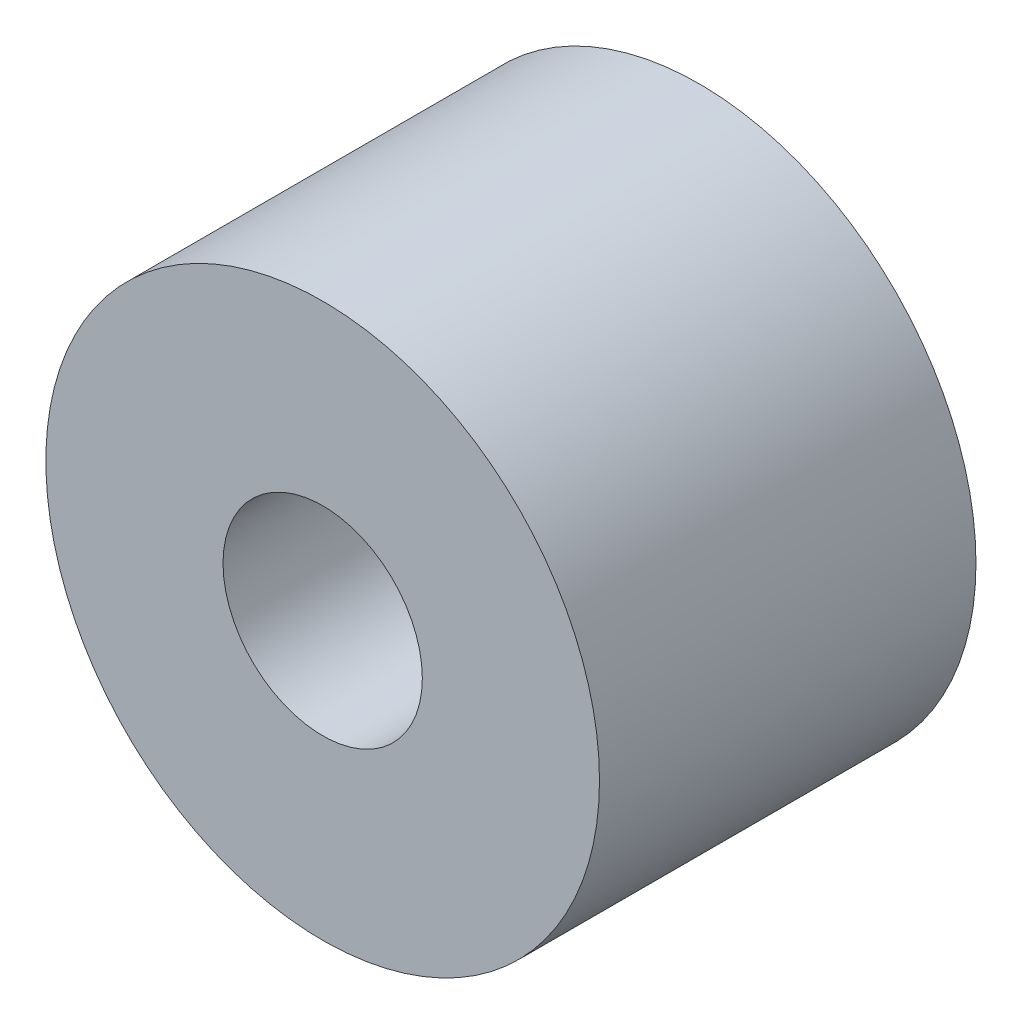
ISO-10303-21;
HEADER;
FILE_DESCRIPTION(('STEP AP214'),'2;1');
FILE_NAME('part.step','',(''),(''),'','','');
FILE_SCHEMA(('AUTOMOTIVE_DESIGN { 1 0 10303 214 1 1 1 1 }'));
ENDSEC;
DATA;
#1=APPLICATION_CONTEXT('core data for automotive mechanical design processes');
#2=APPLICATION_PROTOCOL_DEFINITION('international standard','automotive_design',2000,#1);
#3=PRODUCT_CONTEXT('',#1,'mechanical');
#4=PRODUCT('Part','Part','',(#3));
#5=PRODUCT_RELATED_PRODUCT_CATEGORY('part','',(#4));
#6=PRODUCT_DEFINITION_FORMATION('','',#4);
#7=PRODUCT_DEFINITION_CONTEXT('part definition',#1,'design');
#8=PRODUCT_DEFINITION('design','',#6,#7);
#9=PRODUCT_DEFINITION_SHAPE('','',#8);
#10=(LENGTH_UNIT() NAMED_UNIT(*) SI_UNIT(.MILLI.,.METRE.));
#11=(NAMED_UNIT(*) PLANE_ANGLE_UNIT() SI_UNIT($,.RADIAN.));
#12=(NAMED_UNIT(*) SI_UNIT($,.STERADIAN.) SOLID_ANGLE_UNIT());
#13=UNCERTAINTY_MEASURE_WITH_UNIT(LENGTH_MEASURE(1.E-05),#10,'distance_accuracy_value','');
#14=(GEOMETRIC_REPRESENTATION_CONTEXT(3) GLOBAL_UNCERTAINTY_ASSIGNED_CONTEXT((#13)) GLOBAL_UNIT_ASSIGNED_CONTEXT((#10,
#11,#12)) REPRESENTATION_CONTEXT('',''));
#15=CARTESIAN_POINT('',(0.,0.,0.));
#16=DIRECTION('',(0.,0.,1.));
#17=DIRECTION('',(1.,0.,0.));
#18=AXIS2_PLACEMENT_3D('',#15,#16,#17);
#19=CARTESIAN_POINT('',(0.,0.,17.));
#20=DIRECTION('',(0.,0.,1.));
#21=DIRECTION('',(1.,0.,0.));
#22=AXIS2_PLACEMENT_3D('',#19,#20,#21);
#23=PLANE('',#22);
#24=CARTESIAN_POINT('',(0.,0.,17.));
#25=DIRECTION('',(0.,0.,1.));
#26=DIRECTION('',(1.,0.,0.));
#27=AXIS2_PLACEMENT_3D('',#24,#25,#26);
#28=CIRCLE('',#27,12.5);
#29=CARTESIAN_POINT('',(12.5,0.,17.));
#30=VERTEX_POINT('',#29);
#31=EDGE_CURVE('E12',#30,#30,#28,.T.);
#32=ORIENTED_EDGE('',*,*,#31,.T.);
#33=EDGE_LOOP('',(#32));
#34=FACE_BOUND('',#33,.T.);
#35=CARTESIAN_POINT('',(0.,0.,17.));
#36=DIRECTION('',(0.,0.,1.));
#37=DIRECTION('',(1.,0.,0.));
#38=AXIS2_PLACEMENT_3D('',#35,#36,#37);
#39=CIRCLE('',#38,4.5);
#40=CARTESIAN_POINT('',(4.5,0.,17.));
#41=VERTEX_POINT('',#40);
#42=EDGE_CURVE('E54',#41,#41,#39,.T.);
#43=ORIENTED_EDGE('',*,*,#42,.F.);
#44=EDGE_LOOP('',(#43));
#45=FACE_BOUND('',#44,.T.);
#46=ADVANCED_FACE('F43',(#34,#45),#23,.T.);
#47=CARTESIAN_POINT('',(0.,0.,0.));
#48=DIRECTION('',(0.,0.,1.));
#49=DIRECTION('',(1.,0.,0.));
#50=AXIS2_PLACEMENT_3D('',#47,#48,#49);
#51=PLANE('',#50);
#52=CARTESIAN_POINT('',(0.,0.,0.));
#53=DIRECTION('',(0.,0.,1.));
#54=DIRECTION('',(1.,0.,0.));
#55=AXIS2_PLACEMENT_3D('',#52,#53,#54);
#56=CIRCLE('',#55,12.5);
#57=CARTESIAN_POINT('',(12.5,0.,0.));
#58=VERTEX_POINT('',#57);
#59=EDGE_CURVE('E47',#58,#58,#56,.T.);
#60=ORIENTED_EDGE('',*,*,#59,.F.);
#61=EDGE_LOOP('',(#60));
#62=FACE_BOUND('',#61,.T.);
#63=CARTESIAN_POINT('',(0.,0.,0.));
#64=DIRECTION('',(0.,0.,1.));
#65=DIRECTION('',(1.,0.,0.));
#66=AXIS2_PLACEMENT_3D('',#63,#64,#65);
#67=CIRCLE('',#66,4.5);
#68=CARTESIAN_POINT('',(4.5,0.,0.));
#69=VERTEX_POINT('',#68);
#70=EDGE_CURVE('E56',#69,#69,#67,.T.);
#71=ORIENTED_EDGE('',*,*,#70,.T.);
#72=EDGE_LOOP('',(#71));
#73=FACE_BOUND('',#72,.T.);
#74=ADVANCED_FACE('F66',(#62,#73),#51,.F.);
#75=CARTESIAN_POINT('',(0.,0.,17.));
#76=DIRECTION('',(0.,0.,-1.));
#77=DIRECTION('',(-1.,0.,0.));
#78=AXIS2_PLACEMENT_3D('',#75,#76,#77);
#79=CYLINDRICAL_SURFACE('',#78,12.5);
#80=ORIENTED_EDGE('',*,*,#31,.F.);
#81=EDGE_LOOP('',(#80));
#82=FACE_BOUND('',#81,.T.);
#83=ORIENTED_EDGE('',*,*,#59,.T.);
#84=EDGE_LOOP('',(#83));
#85=FACE_BOUND('',#84,.T.);
#86=ADVANCED_FACE('F45',(#82,#85),#79,.T.);
#87=CARTESIAN_POINT('',(0.,0.,17.));
#88=DIRECTION('',(0.,0.,-1.));
#89=DIRECTION('',(-1.,0.,0.));
#90=AXIS2_PLACEMENT_3D('',#87,#88,#89);
#91=CYLINDRICAL_SURFACE('',#90,4.5);
#92=ORIENTED_EDGE('',*,*,#42,.T.);
#93=EDGE_LOOP('',(#92));
#94=FACE_BOUND('',#93,.T.);
#95=ORIENTED_EDGE('',*,*,#70,.F.);
#96=EDGE_LOOP('',(#95));
#97=FACE_BOUND('',#96,.T.);
#98=ADVANCED_FACE('F62',(#94,#97),#91,.F.);
#99=CLOSED_SHELL('',(#46,#74,#86,#98));
#100=MANIFOLD_SOLID_BREP('B2',#99);
#101=ADVANCED_BREP_SHAPE_REPRESENTATION('',(#18,#100),#14);
#102=SHAPE_DEFINITION_REPRESENTATION(#9,#101);
ENDSEC;
END-ISO-10303-21;
